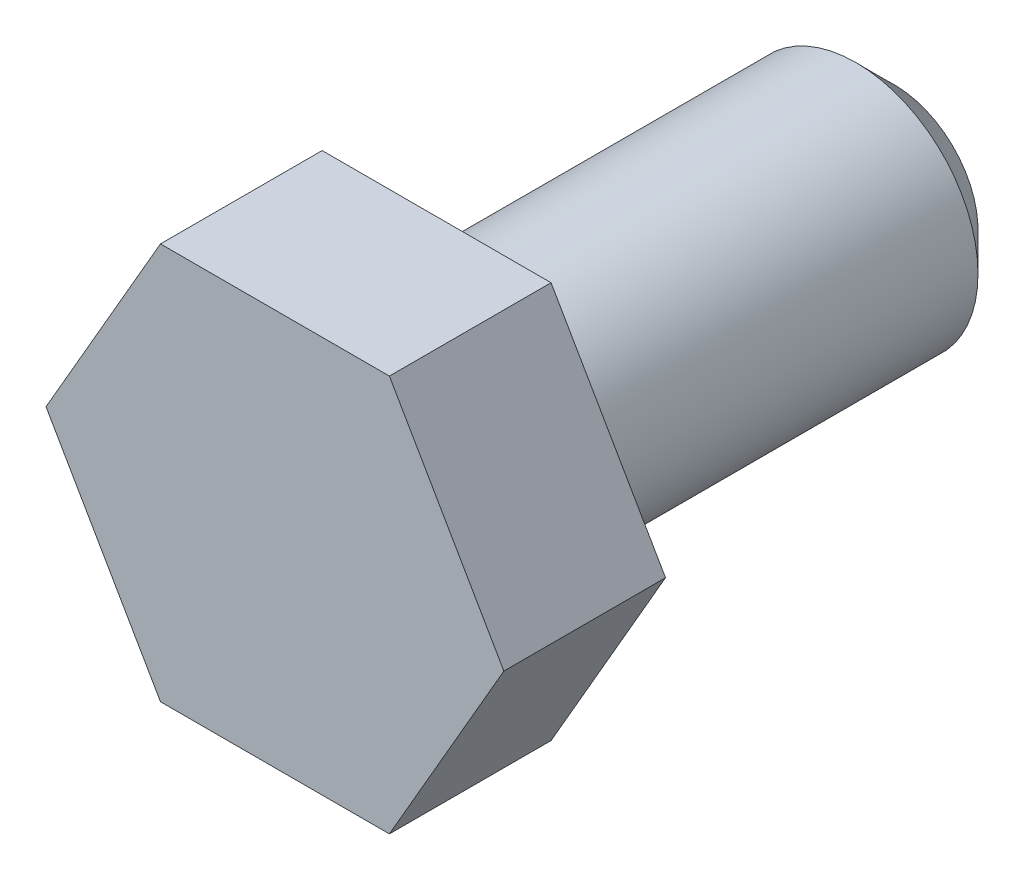
ISO-10303-21;
HEADER;
FILE_DESCRIPTION(('STEP AP214'),'2;1');
FILE_NAME('part.step','',(''),(''),'','','');
FILE_SCHEMA(('AUTOMOTIVE_DESIGN { 1 0 10303 214 1 1 1 1 }'));
ENDSEC;
DATA;
#1=APPLICATION_CONTEXT('core data for automotive mechanical design processes');
#2=APPLICATION_PROTOCOL_DEFINITION('international standard','automotive_design',2000,#1);
#3=PRODUCT_CONTEXT('',#1,'mechanical');
#4=PRODUCT('Part','Part','',(#3));
#5=PRODUCT_RELATED_PRODUCT_CATEGORY('part','',(#4));
#6=PRODUCT_DEFINITION_FORMATION('','',#4);
#7=PRODUCT_DEFINITION_CONTEXT('part definition',#1,'design');
#8=PRODUCT_DEFINITION('design','',#6,#7);
#9=PRODUCT_DEFINITION_SHAPE('','',#8);
#10=(LENGTH_UNIT() NAMED_UNIT(*) SI_UNIT(.MILLI.,.METRE.));
#11=(NAMED_UNIT(*) PLANE_ANGLE_UNIT() SI_UNIT($,.RADIAN.));
#12=(NAMED_UNIT(*) SI_UNIT($,.STERADIAN.) SOLID_ANGLE_UNIT());
#13=UNCERTAINTY_MEASURE_WITH_UNIT(LENGTH_MEASURE(1.E-05),#10,'distance_accuracy_value','');
#14=(GEOMETRIC_REPRESENTATION_CONTEXT(3) GLOBAL_UNCERTAINTY_ASSIGNED_CONTEXT((#13)) GLOBAL_UNIT_ASSIGNED_CONTEXT((#10,
#11,#12)) REPRESENTATION_CONTEXT('',''));
#15=CARTESIAN_POINT('',(0.,0.,0.));
#16=DIRECTION('',(0.,0.,1.));
#17=DIRECTION('',(1.,0.,0.));
#18=AXIS2_PLACEMENT_3D('',#15,#16,#17);
#19=CARTESIAN_POINT('',(-11.2583302491977,-6.5,0.));
#20=DIRECTION('',(0.,0.,1.));
#21=DIRECTION('',(1.,0.,0.));
#22=AXIS2_PLACEMENT_3D('',#19,#20,#21);
#23=PLANE('',#22);
#24=DIRECTION('',(-0.499999999999999,-0.866025403784439,0.));
#25=VECTOR('',#24,1.);
#26=CARTESIAN_POINT('',(-3.75277674973257,6.5,0.));
#27=LINE('',#26,#25);
#28=CARTESIAN_POINT('',(-3.75277674973257,6.5,0.));
#29=VERTEX_POINT('',#28);
#30=CARTESIAN_POINT('',(-7.50555349946513,0.,0.));
#31=VERTEX_POINT('',#30);
#32=EDGE_CURVE('E117',#29,#31,#27,.T.);
#33=ORIENTED_EDGE('',*,*,#32,.F.);
#34=DIRECTION('',(1.,0.,0.));
#35=VECTOR('',#34,1.);
#36=CARTESIAN_POINT('',(-3.75277674973257,6.5,0.));
#37=LINE('',#36,#35);
#38=CARTESIAN_POINT('',(3.75277674973256,6.5,0.));
#39=VERTEX_POINT('',#38);
#40=EDGE_CURVE('E127',#29,#39,#37,.T.);
#41=ORIENTED_EDGE('',*,*,#40,.T.);
#42=DIRECTION('',(0.5,-0.866025403784438,0.));
#43=VECTOR('',#42,1.);
#44=CARTESIAN_POINT('',(3.75277674973256,6.5,0.));
#45=LINE('',#44,#43);
#46=CARTESIAN_POINT('',(7.50555349946513,0.,0.));
#47=VERTEX_POINT('',#46);
#48=EDGE_CURVE('E125',#39,#47,#45,.T.);
#49=ORIENTED_EDGE('',*,*,#48,.T.);
#50=DIRECTION('',(-0.5,-0.866025403784439,0.));
#51=VECTOR('',#50,1.);
#52=CARTESIAN_POINT('',(7.50555349946513,0.,0.));
#53=LINE('',#52,#51);
#54=CARTESIAN_POINT('',(3.75277674973257,-6.5,0.));
#55=VERTEX_POINT('',#54);
#56=EDGE_CURVE('E96',#47,#55,#53,.T.);
#57=ORIENTED_EDGE('',*,*,#56,.T.);
#58=DIRECTION('',(1.,0.,0.));
#59=VECTOR('',#58,1.);
#60=CARTESIAN_POINT('',(-3.75277674973257,-6.5,0.));
#61=LINE('',#60,#59);
#62=CARTESIAN_POINT('',(-3.75277674973257,-6.5,0.));
#63=VERTEX_POINT('',#62);
#64=EDGE_CURVE('E121',#63,#55,#61,.T.);
#65=ORIENTED_EDGE('',*,*,#64,.F.);
#66=DIRECTION('',(0.5,-0.866025403784439,0.));
#67=VECTOR('',#66,1.);
#68=CARTESIAN_POINT('',(-7.50555349946513,0.,0.));
#69=LINE('',#68,#67);
#70=EDGE_CURVE('E119',#31,#63,#69,.T.);
#71=ORIENTED_EDGE('',*,*,#70,.F.);
#72=EDGE_LOOP('',(#33,#41,#49,#57,#65,#71));
#73=FACE_BOUND('',#72,.T.);
#74=CARTESIAN_POINT('',(0.,0.,0.));
#75=DIRECTION('',(0.,0.,1.));
#76=DIRECTION('',(1.,0.,0.));
#77=AXIS2_PLACEMENT_3D('',#74,#75,#76);
#78=CIRCLE('',#77,4.);
#79=CARTESIAN_POINT('',(4.,0.,0.));
#80=VERTEX_POINT('',#79);
#81=EDGE_CURVE('E139',#80,#80,#78,.F.);
#82=ORIENTED_EDGE('',*,*,#81,.F.);
#83=EDGE_LOOP('',(#82));
#84=FACE_BOUND('',#83,.T.);
#85=ADVANCED_FACE('F31',(#73,#84),#23,.F.);
#86=CARTESIAN_POINT('',(-3.75277674973257,6.5,5.3));
#87=DIRECTION('',(0.866025403784439,-0.499999999999999,0.));
#88=DIRECTION('',(0.499999999999999,0.866025403784439,0.));
#89=AXIS2_PLACEMENT_3D('',#86,#87,#88);
#90=PLANE('',#89);
#91=ORIENTED_EDGE('',*,*,#32,.T.);
#92=DIRECTION('',(0.,0.,-1.));
#93=VECTOR('',#92,1.);
#94=CARTESIAN_POINT('',(-7.50555349946513,0.,5.3));
#95=LINE('',#94,#93);
#96=CARTESIAN_POINT('',(-7.50555349946513,0.,5.3));
#97=VERTEX_POINT('',#96);
#98=EDGE_CURVE('E137',#97,#31,#95,.T.);
#99=ORIENTED_EDGE('',*,*,#98,.F.);
#100=DIRECTION('',(-0.499999999999999,-0.866025403784439,0.));
#101=VECTOR('',#100,1.);
#102=CARTESIAN_POINT('',(-3.75277674973257,6.5,5.3));
#103=LINE('',#102,#101);
#104=CARTESIAN_POINT('',(-3.75277674973257,6.5,5.3));
#105=VERTEX_POINT('',#104);
#106=EDGE_CURVE('E130',#105,#97,#103,.T.);
#107=ORIENTED_EDGE('',*,*,#106,.F.);
#108=DIRECTION('',(0.,0.,-1.));
#109=VECTOR('',#108,1.);
#110=CARTESIAN_POINT('',(-3.75277674973257,6.5,5.3));
#111=LINE('',#110,#109);
#112=EDGE_CURVE('E48',#105,#29,#111,.T.);
#113=ORIENTED_EDGE('',*,*,#112,.T.);
#114=EDGE_LOOP('',(#91,#99,#107,#113));
#115=FACE_BOUND('',#114,.T.);
#116=ADVANCED_FACE('F155',(#115),#90,.F.);
#117=CARTESIAN_POINT('',(-7.50555349946513,0.,5.3));
#118=DIRECTION('',(0.866025403784439,0.5,0.));
#119=DIRECTION('',(-0.5,0.866025403784439,0.));
#120=AXIS2_PLACEMENT_3D('',#117,#118,#119);
#121=PLANE('',#120);
#122=ORIENTED_EDGE('',*,*,#70,.T.);
#123=DIRECTION('',(0.,0.,-1.));
#124=VECTOR('',#123,1.);
#125=CARTESIAN_POINT('',(-3.75277674973257,-6.5,5.3));
#126=LINE('',#125,#124);
#127=CARTESIAN_POINT('',(-3.75277674973257,-6.5,5.3));
#128=VERTEX_POINT('',#127);
#129=EDGE_CURVE('E134',#128,#63,#126,.T.);
#130=ORIENTED_EDGE('',*,*,#129,.F.);
#131=DIRECTION('',(0.5,-0.866025403784439,0.));
#132=VECTOR('',#131,1.);
#133=CARTESIAN_POINT('',(-7.50555349946513,0.,5.3));
#134=LINE('',#133,#132);
#135=EDGE_CURVE('E81',#97,#128,#134,.T.);
#136=ORIENTED_EDGE('',*,*,#135,.F.);
#137=ORIENTED_EDGE('',*,*,#98,.T.);
#138=EDGE_LOOP('',(#122,#130,#136,#137));
#139=FACE_BOUND('',#138,.T.);
#140=ADVANCED_FACE('F161',(#139),#121,.F.);
#141=CARTESIAN_POINT('',(-3.75277674973257,-6.5,5.3));
#142=DIRECTION('',(0.,1.,0.));
#143=DIRECTION('',(0.,0.,1.));
#144=AXIS2_PLACEMENT_3D('',#141,#142,#143);
#145=PLANE('',#144);
#146=ORIENTED_EDGE('',*,*,#64,.T.);
#147=DIRECTION('',(0.,0.,-1.));
#148=VECTOR('',#147,1.);
#149=CARTESIAN_POINT('',(3.75277674973257,-6.5,5.3));
#150=LINE('',#149,#148);
#151=CARTESIAN_POINT('',(3.75277674973257,-6.5,5.3));
#152=VERTEX_POINT('',#151);
#153=EDGE_CURVE('E100',#152,#55,#150,.T.);
#154=ORIENTED_EDGE('',*,*,#153,.F.);
#155=DIRECTION('',(1.,0.,0.));
#156=VECTOR('',#155,1.);
#157=CARTESIAN_POINT('',(-3.75277674973257,-6.5,5.3));
#158=LINE('',#157,#156);
#159=EDGE_CURVE('E108',#128,#152,#158,.T.);
#160=ORIENTED_EDGE('',*,*,#159,.F.);
#161=ORIENTED_EDGE('',*,*,#129,.T.);
#162=EDGE_LOOP('',(#146,#154,#160,#161));
#163=FACE_BOUND('',#162,.T.);
#164=ADVANCED_FACE('F173',(#163),#145,.F.);
#165=CARTESIAN_POINT('',(7.50555349946513,0.,5.3));
#166=DIRECTION('',(0.866025403784439,-0.5,0.));
#167=DIRECTION('',(0.5,0.866025403784439,0.));
#168=AXIS2_PLACEMENT_3D('',#165,#166,#167);
#169=PLANE('',#168);
#170=ORIENTED_EDGE('',*,*,#56,.F.);
#171=DIRECTION('',(0.,0.,-1.));
#172=VECTOR('',#171,1.);
#173=CARTESIAN_POINT('',(7.50555349946513,0.,5.3));
#174=LINE('',#173,#172);
#175=CARTESIAN_POINT('',(7.50555349946513,0.,5.3));
#176=VERTEX_POINT('',#175);
#177=EDGE_CURVE('E91',#176,#47,#174,.T.);
#178=ORIENTED_EDGE('',*,*,#177,.F.);
#179=DIRECTION('',(-0.5,-0.866025403784439,0.));
#180=VECTOR('',#179,1.);
#181=CARTESIAN_POINT('',(7.50555349946513,0.,5.3));
#182=LINE('',#181,#180);
#183=EDGE_CURVE('E94',#176,#152,#182,.T.);
#184=ORIENTED_EDGE('',*,*,#183,.T.);
#185=ORIENTED_EDGE('',*,*,#153,.T.);
#186=EDGE_LOOP('',(#170,#178,#184,#185));
#187=FACE_BOUND('',#186,.T.);
#188=ADVANCED_FACE('F93',(#187),#169,.T.);
#189=CARTESIAN_POINT('',(3.75277674973256,6.5,5.3));
#190=DIRECTION('',(0.866025403784438,0.5,0.));
#191=DIRECTION('',(-0.5,0.866025403784438,0.));
#192=AXIS2_PLACEMENT_3D('',#189,#190,#191);
#193=PLANE('',#192);
#194=ORIENTED_EDGE('',*,*,#48,.F.);
#195=DIRECTION('',(0.,0.,-1.));
#196=VECTOR('',#195,1.);
#197=CARTESIAN_POINT('',(3.75277674973256,6.5,5.3));
#198=LINE('',#197,#196);
#199=CARTESIAN_POINT('',(3.75277674973256,6.5,5.3));
#200=VERTEX_POINT('',#199);
#201=EDGE_CURVE('E68',#200,#39,#198,.T.);
#202=ORIENTED_EDGE('',*,*,#201,.F.);
#203=DIRECTION('',(0.5,-0.866025403784438,0.));
#204=VECTOR('',#203,1.);
#205=CARTESIAN_POINT('',(3.75277674973256,6.5,5.3));
#206=LINE('',#205,#204);
#207=EDGE_CURVE('E106',#200,#176,#206,.T.);
#208=ORIENTED_EDGE('',*,*,#207,.T.);
#209=ORIENTED_EDGE('',*,*,#177,.T.);
#210=EDGE_LOOP('',(#194,#202,#208,#209));
#211=FACE_BOUND('',#210,.T.);
#212=ADVANCED_FACE('F111',(#211),#193,.T.);
#213=CARTESIAN_POINT('',(-3.75277674973257,6.5,5.3));
#214=DIRECTION('',(0.,1.,0.));
#215=DIRECTION('',(0.,0.,1.));
#216=AXIS2_PLACEMENT_3D('',#213,#214,#215);
#217=PLANE('',#216);
#218=ORIENTED_EDGE('',*,*,#40,.F.);
#219=ORIENTED_EDGE('',*,*,#112,.F.);
#220=DIRECTION('',(1.,0.,0.));
#221=VECTOR('',#220,1.);
#222=CARTESIAN_POINT('',(-3.75277674973257,6.5,5.3));
#223=LINE('',#222,#221);
#224=EDGE_CURVE('E112',#105,#200,#223,.T.);
#225=ORIENTED_EDGE('',*,*,#224,.T.);
#226=ORIENTED_EDGE('',*,*,#201,.T.);
#227=EDGE_LOOP('',(#218,#219,#225,#226));
#228=FACE_BOUND('',#227,.T.);
#229=ADVANCED_FACE('F166',(#228),#217,.T.);
#230=CARTESIAN_POINT('',(-11.2583302491977,-6.5,5.3));
#231=DIRECTION('',(0.,0.,1.));
#232=DIRECTION('',(1.,0.,0.));
#233=AXIS2_PLACEMENT_3D('',#230,#231,#232);
#234=PLANE('',#233);
#235=ORIENTED_EDGE('',*,*,#106,.T.);
#236=ORIENTED_EDGE('',*,*,#135,.T.);
#237=ORIENTED_EDGE('',*,*,#159,.T.);
#238=ORIENTED_EDGE('',*,*,#183,.F.);
#239=ORIENTED_EDGE('',*,*,#207,.F.);
#240=ORIENTED_EDGE('',*,*,#224,.F.);
#241=EDGE_LOOP('',(#235,#236,#237,#238,#239,#240));
#242=FACE_BOUND('',#241,.T.);
#243=ADVANCED_FACE('F104',(#242),#234,.T.);
#244=CARTESIAN_POINT('',(0.,0.,-15.));
#245=DIRECTION('',(0.,0.,1.));
#246=DIRECTION('',(1.,0.,0.));
#247=AXIS2_PLACEMENT_3D('',#244,#245,#246);
#248=CYLINDRICAL_SURFACE('',#247,4.);
#249=CARTESIAN_POINT('',(0.,0.,-13.75));
#250=DIRECTION('',(0.,0.,-1.));
#251=DIRECTION('',(-1.,0.,0.));
#252=AXIS2_PLACEMENT_3D('',#249,#250,#251);
#253=CIRCLE('',#252,4.);
#254=CARTESIAN_POINT('',(-4.,0.,-13.75));
#255=VERTEX_POINT('',#254);
#256=EDGE_CURVE('E11',#255,#255,#253,.F.);
#257=ORIENTED_EDGE('',*,*,#256,.T.);
#258=EDGE_LOOP('',(#257));
#259=FACE_BOUND('',#258,.T.);
#260=ORIENTED_EDGE('',*,*,#81,.T.);
#261=EDGE_LOOP('',(#260));
#262=FACE_BOUND('',#261,.T.);
#263=ADVANCED_FACE('F151',(#259,#262),#248,.T.);
#264=CARTESIAN_POINT('',(0.,0.,-15.));
#265=DIRECTION('',(0.,0.,-1.));
#266=DIRECTION('',(-1.,0.,0.));
#267=AXIS2_PLACEMENT_3D('',#264,#265,#266);
#268=PLANE('',#267);
#269=CARTESIAN_POINT('',(0.,0.,-15.));
#270=DIRECTION('',(0.,0.,-1.));
#271=DIRECTION('',(-1.,0.,0.));
#272=AXIS2_PLACEMENT_3D('',#269,#270,#271);
#273=CIRCLE('',#272,2.74999999999998);
#274=CARTESIAN_POINT('',(-2.74999999999998,0.,-15.));
#275=VERTEX_POINT('',#274);
#276=EDGE_CURVE('E40',#275,#275,#273,.T.);
#277=ORIENTED_EDGE('',*,*,#276,.T.);
#278=EDGE_LOOP('',(#277));
#279=FACE_BOUND('',#278,.T.);
#280=ADVANCED_FACE('F144',(#279),#268,.T.);
#281=CARTESIAN_POINT('',(0.,0.,-15.));
#282=DIRECTION('',(0.,0.,1.));
#283=DIRECTION('',(1.,0.,0.));
#284=AXIS2_PLACEMENT_3D('',#281,#282,#283);
#285=CONICAL_SURFACE('',#284,2.74999999999998,0.785398163397454);
#286=ORIENTED_EDGE('',*,*,#256,.F.);
#287=EDGE_LOOP('',(#286));
#288=FACE_BOUND('',#287,.T.);
#289=ORIENTED_EDGE('',*,*,#276,.F.);
#290=EDGE_LOOP('',(#289));
#291=FACE_BOUND('',#290,.T.);
#292=ADVANCED_FACE('F33',(#288,#291),#285,.T.);
#293=CLOSED_SHELL('',(#85,#116,#140,#164,#188,#212,#229,#243,#263,#280,#292));
#294=MANIFOLD_SOLID_BREP('B2',#293);
#295=ADVANCED_BREP_SHAPE_REPRESENTATION('',(#18,#294),#14);
#296=SHAPE_DEFINITION_REPRESENTATION(#9,#295);
ENDSEC;
END-ISO-10303-21;
